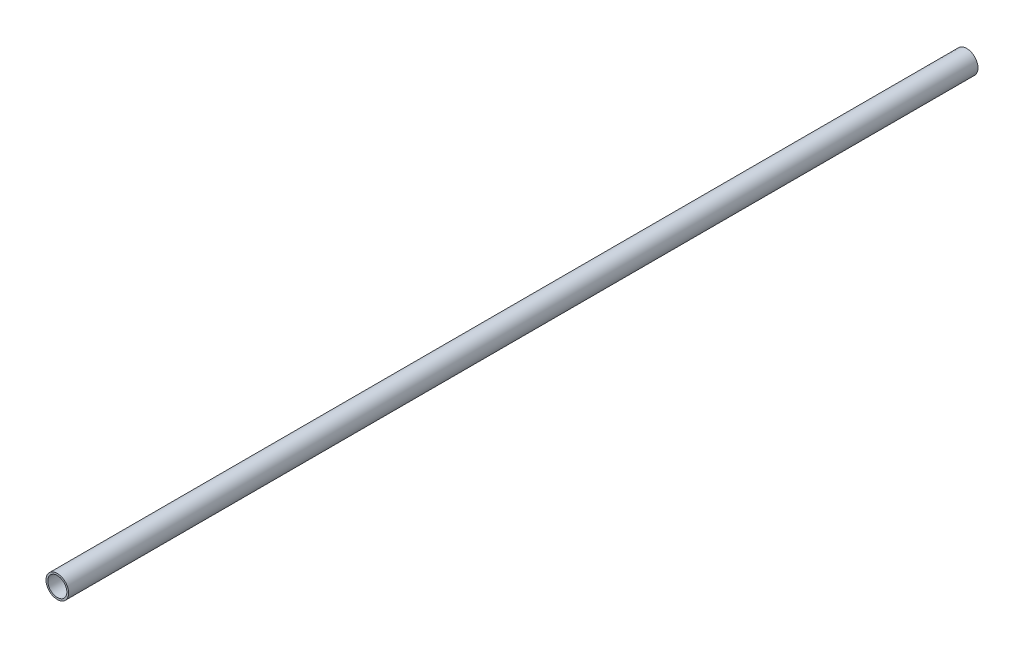
ISO-10303-21;
HEADER;
FILE_DESCRIPTION(('STEP AP214'),'2;1');
FILE_NAME('part.step','',(''),(''),'','','');
FILE_SCHEMA(('AUTOMOTIVE_DESIGN { 1 0 10303 214 1 1 1 1 }'));
ENDSEC;
DATA;
#1=APPLICATION_CONTEXT('core data for automotive mechanical design processes');
#2=APPLICATION_PROTOCOL_DEFINITION('international standard','automotive_design',2000,#1);
#3=PRODUCT_CONTEXT('',#1,'mechanical');
#4=PRODUCT('Part','Part','',(#3));
#5=PRODUCT_RELATED_PRODUCT_CATEGORY('part','',(#4));
#6=PRODUCT_DEFINITION_FORMATION('','',#4);
#7=PRODUCT_DEFINITION_CONTEXT('part definition',#1,'design');
#8=PRODUCT_DEFINITION('design','',#6,#7);
#9=PRODUCT_DEFINITION_SHAPE('','',#8);
#10=(LENGTH_UNIT() NAMED_UNIT(*) SI_UNIT(.MILLI.,.METRE.));
#11=(NAMED_UNIT(*) PLANE_ANGLE_UNIT() SI_UNIT($,.RADIAN.));
#12=(NAMED_UNIT(*) SI_UNIT($,.STERADIAN.) SOLID_ANGLE_UNIT());
#13=UNCERTAINTY_MEASURE_WITH_UNIT(LENGTH_MEASURE(1.E-05),#10,'distance_accuracy_value','');
#14=(GEOMETRIC_REPRESENTATION_CONTEXT(3) GLOBAL_UNCERTAINTY_ASSIGNED_CONTEXT((#13)) GLOBAL_UNIT_ASSIGNED_CONTEXT((#10,
#11,#12)) REPRESENTATION_CONTEXT('',''));
#15=CARTESIAN_POINT('',(0.,0.,0.));
#16=DIRECTION('',(0.,0.,1.));
#17=DIRECTION('',(1.,0.,0.));
#18=AXIS2_PLACEMENT_3D('',#15,#16,#17);
#19=CARTESIAN_POINT('',(0.,0.,1020.));
#20=DIRECTION('',(0.,0.,-1.));
#21=DIRECTION('',(-1.,0.,0.));
#22=AXIS2_PLACEMENT_3D('',#19,#20,#21);
#23=CYLINDRICAL_SURFACE('',#22,12.7);
#24=CARTESIAN_POINT('',(0.,0.,1020.));
#25=DIRECTION('',(0.,0.,1.));
#26=DIRECTION('',(1.,0.,0.));
#27=AXIS2_PLACEMENT_3D('',#24,#25,#26);
#28=CIRCLE('',#27,12.7);
#29=CARTESIAN_POINT('',(12.7,0.,1020.));
#30=VERTEX_POINT('',#29);
#31=EDGE_CURVE('E43',#30,#30,#28,.T.);
#32=ORIENTED_EDGE('',*,*,#31,.F.);
#33=EDGE_LOOP('',(#32));
#34=FACE_BOUND('',#33,.T.);
#35=CARTESIAN_POINT('',(0.,0.,0.));
#36=DIRECTION('',(0.,0.,1.));
#37=DIRECTION('',(1.,0.,0.));
#38=AXIS2_PLACEMENT_3D('',#35,#36,#37);
#39=CIRCLE('',#38,12.7);
#40=CARTESIAN_POINT('',(12.7,0.,0.));
#41=VERTEX_POINT('',#40);
#42=EDGE_CURVE('E49',#41,#41,#39,.T.);
#43=ORIENTED_EDGE('',*,*,#42,.T.);
#44=EDGE_LOOP('',(#43));
#45=FACE_BOUND('',#44,.T.);
#46=ADVANCED_FACE('F36',(#34,#45),#23,.T.);
#47=CARTESIAN_POINT('',(0.,0.,1020.));
#48=DIRECTION('',(0.,0.,-1.));
#49=DIRECTION('',(-1.,0.,0.));
#50=AXIS2_PLACEMENT_3D('',#47,#48,#49);
#51=CYLINDRICAL_SURFACE('',#50,10.7);
#52=CARTESIAN_POINT('',(0.,0.,1020.));
#53=DIRECTION('',(0.,0.,1.));
#54=DIRECTION('',(1.,0.,0.));
#55=AXIS2_PLACEMENT_3D('',#52,#53,#54);
#56=CIRCLE('',#55,10.7);
#57=CARTESIAN_POINT('',(10.7,0.,1020.));
#58=VERTEX_POINT('',#57);
#59=EDGE_CURVE('E10',#58,#58,#56,.T.);
#60=ORIENTED_EDGE('',*,*,#59,.T.);
#61=EDGE_LOOP('',(#60));
#62=FACE_BOUND('',#61,.T.);
#63=CARTESIAN_POINT('',(0.,0.,0.));
#64=DIRECTION('',(0.,0.,1.));
#65=DIRECTION('',(1.,0.,0.));
#66=AXIS2_PLACEMENT_3D('',#63,#64,#65);
#67=CIRCLE('',#66,10.7);
#68=CARTESIAN_POINT('',(10.7,0.,0.));
#69=VERTEX_POINT('',#68);
#70=EDGE_CURVE('E39',#69,#69,#67,.T.);
#71=ORIENTED_EDGE('',*,*,#70,.F.);
#72=EDGE_LOOP('',(#71));
#73=FACE_BOUND('',#72,.T.);
#74=ADVANCED_FACE('F58',(#62,#73),#51,.F.);
#75=CARTESIAN_POINT('',(0.,0.,1020.));
#76=DIRECTION('',(0.,0.,1.));
#77=DIRECTION('',(1.,0.,0.));
#78=AXIS2_PLACEMENT_3D('',#75,#76,#77);
#79=PLANE('',#78);
#80=ORIENTED_EDGE('',*,*,#31,.T.);
#81=EDGE_LOOP('',(#80));
#82=FACE_BOUND('',#81,.T.);
#83=ORIENTED_EDGE('',*,*,#59,.F.);
#84=EDGE_LOOP('',(#83));
#85=FACE_BOUND('',#84,.T.);
#86=ADVANCED_FACE('F60',(#82,#85),#79,.T.);
#87=CARTESIAN_POINT('',(0.,0.,0.));
#88=DIRECTION('',(0.,0.,1.));
#89=DIRECTION('',(1.,0.,0.));
#90=AXIS2_PLACEMENT_3D('',#87,#88,#89);
#91=PLANE('',#90);
#92=ORIENTED_EDGE('',*,*,#42,.F.);
#93=EDGE_LOOP('',(#92));
#94=FACE_BOUND('',#93,.T.);
#95=ORIENTED_EDGE('',*,*,#70,.T.);
#96=EDGE_LOOP('',(#95));
#97=FACE_BOUND('',#96,.T.);
#98=ADVANCED_FACE('F56',(#94,#97),#91,.F.);
#99=CLOSED_SHELL('',(#46,#74,#86,#98));
#100=MANIFOLD_SOLID_BREP('B2',#99);
#101=ADVANCED_BREP_SHAPE_REPRESENTATION('',(#18,#100),#14);
#102=SHAPE_DEFINITION_REPRESENTATION(#9,#101);
ENDSEC;
END-ISO-10303-21;
